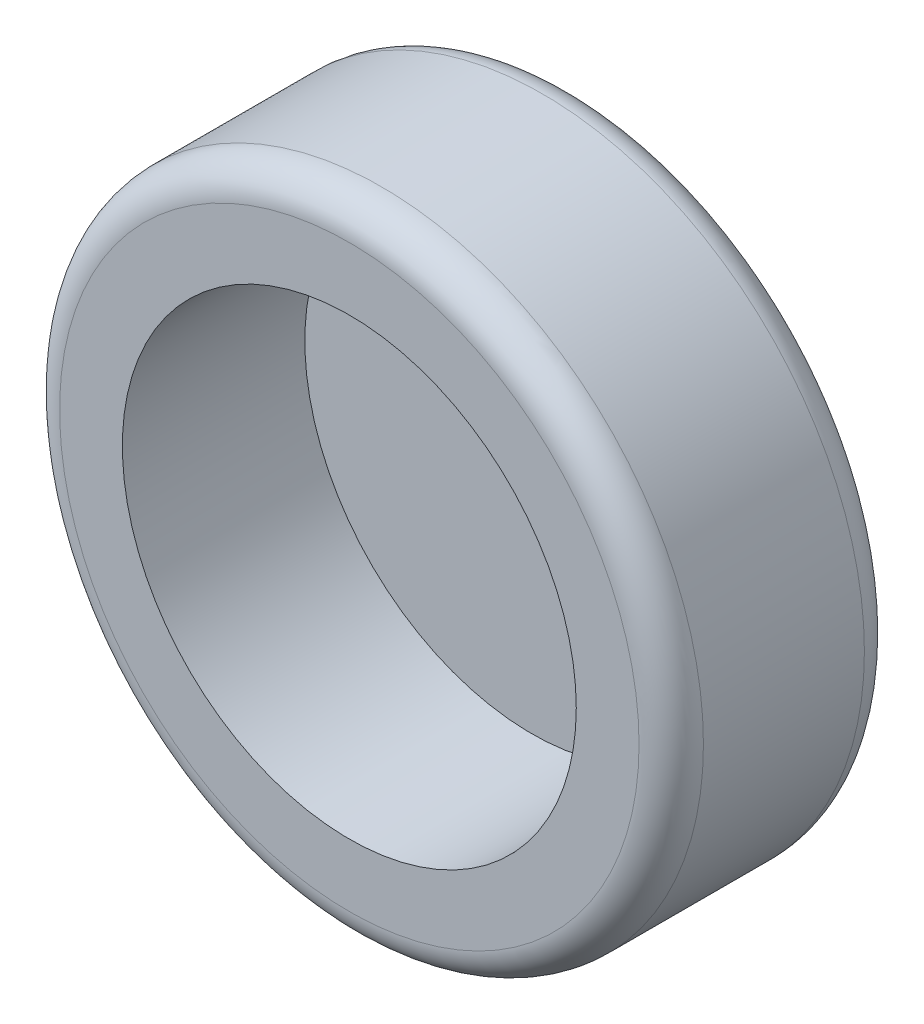
ISO-10303-21;
HEADER;
FILE_DESCRIPTION(('STEP AP214'),'2;1');
FILE_NAME('part.step','',(''),(''),'','','');
FILE_SCHEMA(('AUTOMOTIVE_DESIGN { 1 0 10303 214 1 1 1 1 }'));
ENDSEC;
DATA;
#1=APPLICATION_CONTEXT('core data for automotive mechanical design processes');
#2=APPLICATION_PROTOCOL_DEFINITION('international standard','automotive_design',2000,#1);
#3=PRODUCT_CONTEXT('',#1,'mechanical');
#4=PRODUCT('Part','Part','',(#3));
#5=PRODUCT_RELATED_PRODUCT_CATEGORY('part','',(#4));
#6=PRODUCT_DEFINITION_FORMATION('','',#4);
#7=PRODUCT_DEFINITION_CONTEXT('part definition',#1,'design');
#8=PRODUCT_DEFINITION('design','',#6,#7);
#9=PRODUCT_DEFINITION_SHAPE('','',#8);
#10=(LENGTH_UNIT() NAMED_UNIT(*) SI_UNIT(.MILLI.,.METRE.));
#11=(NAMED_UNIT(*) PLANE_ANGLE_UNIT() SI_UNIT($,.RADIAN.));
#12=(NAMED_UNIT(*) SI_UNIT($,.STERADIAN.) SOLID_ANGLE_UNIT());
#13=UNCERTAINTY_MEASURE_WITH_UNIT(LENGTH_MEASURE(1.E-05),#10,'distance_accuracy_value','');
#14=(GEOMETRIC_REPRESENTATION_CONTEXT(3) GLOBAL_UNCERTAINTY_ASSIGNED_CONTEXT((#13)) GLOBAL_UNIT_ASSIGNED_CONTEXT((#10,
#11,#12)) REPRESENTATION_CONTEXT('',''));
#15=CARTESIAN_POINT('',(0.,0.,0.));
#16=DIRECTION('',(0.,0.,1.));
#17=DIRECTION('',(1.,0.,0.));
#18=AXIS2_PLACEMENT_3D('',#15,#16,#17);
#19=CARTESIAN_POINT('',(0.,0.,21.));
#20=DIRECTION('',(0.,0.,1.));
#21=DIRECTION('',(1.,0.,0.));
#22=AXIS2_PLACEMENT_3D('',#19,#20,#21);
#23=PLANE('',#22);
#24=CARTESIAN_POINT('',(0.,0.,21.));
#25=DIRECTION('',(0.,0.,1.));
#26=DIRECTION('',(1.,0.,0.));
#27=AXIS2_PLACEMENT_3D('',#24,#25,#26);
#28=CIRCLE('',#27,27.);
#29=CARTESIAN_POINT('',(27.,0.,21.));
#30=VERTEX_POINT('',#29);
#31=EDGE_CURVE('E64',#30,#30,#28,.T.);
#32=ORIENTED_EDGE('',*,*,#31,.T.);
#33=EDGE_LOOP('',(#32));
#34=FACE_BOUND('',#33,.T.);
#35=CARTESIAN_POINT('',(0.,0.,21.));
#36=DIRECTION('',(0.,0.,1.));
#37=DIRECTION('',(1.,0.,0.));
#38=AXIS2_PLACEMENT_3D('',#35,#36,#37);
#39=CIRCLE('',#38,21.15);
#40=CARTESIAN_POINT('',(21.15,0.,21.));
#41=VERTEX_POINT('',#40);
#42=EDGE_CURVE('E47',#41,#41,#39,.T.);
#43=ORIENTED_EDGE('',*,*,#42,.F.);
#44=EDGE_LOOP('',(#43));
#45=FACE_BOUND('',#44,.T.);
#46=ADVANCED_FACE('F39',(#34,#45),#23,.T.);
#47=CARTESIAN_POINT('',(0.,0.,-59.8212336883819));
#48=DIRECTION('',(0.,0.,1.));
#49=DIRECTION('',(1.,0.,0.));
#50=AXIS2_PLACEMENT_3D('',#47,#48,#49);
#51=CYLINDRICAL_SURFACE('',#50,21.15);
#52=CARTESIAN_POINT('',(0.,0.,4.));
#53=DIRECTION('',(0.,0.,1.));
#54=DIRECTION('',(1.,0.,0.));
#55=AXIS2_PLACEMENT_3D('',#52,#53,#54);
#56=CIRCLE('',#55,21.15);
#57=CARTESIAN_POINT('',(21.15,0.,4.));
#58=VERTEX_POINT('',#57);
#59=EDGE_CURVE('E11',#58,#58,#56,.F.);
#60=ORIENTED_EDGE('',*,*,#59,.T.);
#61=EDGE_LOOP('',(#60));
#62=FACE_BOUND('',#61,.T.);
#63=ORIENTED_EDGE('',*,*,#42,.T.);
#64=EDGE_LOOP('',(#63));
#65=FACE_BOUND('',#64,.T.);
#66=ADVANCED_FACE('F85',(#62,#65),#51,.F.);
#67=CARTESIAN_POINT('',(0.,0.,4.));
#68=DIRECTION('',(0.,0.,1.));
#69=DIRECTION('',(1.,0.,0.));
#70=AXIS2_PLACEMENT_3D('',#67,#68,#69);
#71=PLANE('',#70);
#72=ORIENTED_EDGE('',*,*,#59,.F.);
#73=EDGE_LOOP('',(#72));
#74=FACE_BOUND('',#73,.T.);
#75=ADVANCED_FACE('F90',(#74),#71,.T.);
#76=CARTESIAN_POINT('',(0.,0.,18.));
#77=DIRECTION('',(0.,0.,1.));
#78=DIRECTION('',(1.,0.,0.));
#79=AXIS2_PLACEMENT_3D('',#76,#77,#78);
#80=TOROIDAL_SURFACE('',#79,27.,3.);
#81=ORIENTED_EDGE('',*,*,#31,.F.);
#82=EDGE_LOOP('',(#81));
#83=FACE_BOUND('',#82,.T.);
#84=CARTESIAN_POINT('',(0.,0.,18.));
#85=DIRECTION('',(0.,0.,1.));
#86=DIRECTION('',(1.,0.,0.));
#87=AXIS2_PLACEMENT_3D('',#84,#85,#86);
#88=CIRCLE('',#87,30.);
#89=CARTESIAN_POINT('',(-30.,0.,18.));
#90=VERTEX_POINT('',#89);
#91=EDGE_CURVE('E60',#90,#90,#88,.T.);
#92=ORIENTED_EDGE('',*,*,#91,.T.);
#93=EDGE_LOOP('',(#92));
#94=FACE_BOUND('',#93,.T.);
#95=ADVANCED_FACE('F96',(#83,#94),#80,.T.);
#96=CARTESIAN_POINT('',(0.,0.,21.));
#97=DIRECTION('',(0.,0.,-1.));
#98=DIRECTION('',(-1.,0.,0.));
#99=AXIS2_PLACEMENT_3D('',#96,#97,#98);
#100=CYLINDRICAL_SURFACE('',#99,30.);
#101=CARTESIAN_POINT('',(0.,0.,3.));
#102=DIRECTION('',(0.,0.,1.));
#103=DIRECTION('',(1.,0.,0.));
#104=AXIS2_PLACEMENT_3D('',#101,#102,#103);
#105=CIRCLE('',#104,30.);
#106=CARTESIAN_POINT('',(-30.,0.,3.));
#107=VERTEX_POINT('',#106);
#108=EDGE_CURVE('E57',#107,#107,#105,.T.);
#109=CARTESIAN_POINT('',(-30.,0.,18.));
#110=CARTESIAN_POINT('',(-30.,0.,17.84375));
#111=CARTESIAN_POINT('',(-30.,0.,17.6875));
#112=CARTESIAN_POINT('',(-30.,0.,17.375));
#113=CARTESIAN_POINT('',(-30.,0.,17.21875));
#114=CARTESIAN_POINT('',(-30.,0.,16.90625));
#115=CARTESIAN_POINT('',(-30.,0.,16.75));
#116=CARTESIAN_POINT('',(-30.,0.,16.4375));
#117=CARTESIAN_POINT('',(-30.,0.,16.28125));
#118=CARTESIAN_POINT('',(-30.,0.,15.96875));
#119=CARTESIAN_POINT('',(-30.,0.,15.8125));
#120=CARTESIAN_POINT('',(-30.,0.,15.5));
#121=CARTESIAN_POINT('',(-30.,0.,15.34375));
#122=CARTESIAN_POINT('',(-30.,0.,15.03125));
#123=CARTESIAN_POINT('',(-30.,0.,14.875));
#124=CARTESIAN_POINT('',(-30.,0.,14.5625));
#125=CARTESIAN_POINT('',(-30.,0.,14.40625));
#126=CARTESIAN_POINT('',(-30.,0.,14.09375));
#127=CARTESIAN_POINT('',(-30.,0.,13.9375));
#128=CARTESIAN_POINT('',(-30.,0.,13.625));
#129=CARTESIAN_POINT('',(-30.,0.,13.46875));
#130=CARTESIAN_POINT('',(-30.,0.,13.15625));
#131=CARTESIAN_POINT('',(-30.,0.,13.));
#132=CARTESIAN_POINT('',(-30.,0.,12.6875));
#133=CARTESIAN_POINT('',(-30.,0.,12.53125));
#134=CARTESIAN_POINT('',(-30.,0.,12.21875));
#135=CARTESIAN_POINT('',(-30.,0.,12.0625));
#136=CARTESIAN_POINT('',(-30.,0.,11.75));
#137=CARTESIAN_POINT('',(-30.,0.,11.59375));
#138=CARTESIAN_POINT('',(-30.,0.,11.28125));
#139=CARTESIAN_POINT('',(-30.,0.,11.125));
#140=CARTESIAN_POINT('',(-30.,0.,10.8125));
#141=CARTESIAN_POINT('',(-30.,0.,10.65625));
#142=CARTESIAN_POINT('',(-30.,0.,10.34375));
#143=CARTESIAN_POINT('',(-30.,0.,10.1875));
#144=CARTESIAN_POINT('',(-30.,0.,9.875));
#145=CARTESIAN_POINT('',(-30.,0.,9.71875));
#146=CARTESIAN_POINT('',(-30.,0.,9.40625));
#147=CARTESIAN_POINT('',(-30.,0.,9.25));
#148=CARTESIAN_POINT('',(-30.,0.,8.9375));
#149=CARTESIAN_POINT('',(-30.,0.,8.78125));
#150=CARTESIAN_POINT('',(-30.,0.,8.46875));
#151=CARTESIAN_POINT('',(-30.,0.,8.3125));
#152=CARTESIAN_POINT('',(-30.,0.,8.));
#153=CARTESIAN_POINT('',(-30.,0.,7.84375));
#154=CARTESIAN_POINT('',(-30.,0.,7.53125));
#155=CARTESIAN_POINT('',(-30.,0.,7.375));
#156=CARTESIAN_POINT('',(-30.,0.,7.0625));
#157=CARTESIAN_POINT('',(-30.,0.,6.90625));
#158=CARTESIAN_POINT('',(-30.,0.,6.59375));
#159=CARTESIAN_POINT('',(-30.,0.,6.4375));
#160=CARTESIAN_POINT('',(-30.,0.,6.125));
#161=CARTESIAN_POINT('',(-30.,0.,5.96875));
#162=CARTESIAN_POINT('',(-30.,0.,5.65625));
#163=CARTESIAN_POINT('',(-30.,0.,5.5));
#164=CARTESIAN_POINT('',(-30.,0.,5.1875));
#165=CARTESIAN_POINT('',(-30.,0.,5.03125));
#166=CARTESIAN_POINT('',(-30.,0.,4.71875));
#167=CARTESIAN_POINT('',(-30.,0.,4.5625));
#168=CARTESIAN_POINT('',(-30.,0.,4.25));
#169=CARTESIAN_POINT('',(-30.,0.,4.09375));
#170=CARTESIAN_POINT('',(-30.,0.,3.78125));
#171=CARTESIAN_POINT('',(-30.,0.,3.625));
#172=CARTESIAN_POINT('',(-30.,0.,3.3125));
#173=CARTESIAN_POINT('',(-30.,0.,3.15625));
#174=CARTESIAN_POINT('',(-30.,0.,3.));
#175=B_SPLINE_CURVE_WITH_KNOTS('',3,(#109,#110,#111,#112,#113,#114,#115,#116,#117,#118,#119,
#120,#121,#122,#123,#124,#125,#126,#127,#128,#129,#130,#131,#132,#133,#134,#135,#136,#137,#138,
#139,#140,#141,#142,#143,#144,#145,#146,#147,#148,#149,#150,#151,#152,#153,#154,#155,#156,#157,
#158,#159,#160,#161,#162,#163,#164,#165,#166,#167,#168,#169,#170,#171,#172,#173,#174),
.UNSPECIFIED.,.F.,.F.,(4,2,2,2,2,2,2,2,2,2,2,2,2,2,2,2,2,2,2,2,2,2,2,2,2,2,2,2,2,2,2,2,4),(0.,
0.46875,0.937499999999997,1.40625,1.875,2.34375,2.8125,3.28125,3.75,4.21875,4.6875,5.15625,
5.625,6.09375,6.5625,7.03125,7.5,7.96875,8.4375,8.90625,9.375,9.84375,10.3125,10.78125,11.25,
11.71875,12.1875,12.65625,13.125,13.59375,14.0625,14.53125,15.),.UNSPECIFIED.);
#176=EDGE_CURVE('BSEAM41',#90,#107,#175,.T.);
#177=ORIENTED_EDGE('',*,*,#91,.F.);
#178=ORIENTED_EDGE('',*,*,#108,.T.);
#179=ORIENTED_EDGE('',*,*,#176,.T.);
#180=ORIENTED_EDGE('',*,*,#176,.F.);
#181=EDGE_LOOP('',(#177,#179,#178,#180));
#182=FACE_BOUND('',#181,.T.);
#183=ADVANCED_FACE('F41',(#182),#100,.T.);
#184=CARTESIAN_POINT('',(0.,0.,3.));
#185=DIRECTION('',(0.,0.,1.));
#186=DIRECTION('',(1.,0.,0.));
#187=AXIS2_PLACEMENT_3D('',#184,#185,#186);
#188=TOROIDAL_SURFACE('',#187,27.,3.);
#189=ORIENTED_EDGE('',*,*,#108,.F.);
#190=EDGE_LOOP('',(#189));
#191=FACE_BOUND('',#190,.T.);
#192=CARTESIAN_POINT('',(0.,0.,1.36609473733174E-13));
#193=DIRECTION('',(0.,0.,1.));
#194=DIRECTION('',(1.,0.,0.));
#195=AXIS2_PLACEMENT_3D('',#192,#193,#194);
#196=CIRCLE('',#195,27.);
#197=CARTESIAN_POINT('',(27.,0.,1.36609473733174E-13));
#198=VERTEX_POINT('',#197);
#199=EDGE_CURVE('E52',#198,#198,#196,.T.);
#200=ORIENTED_EDGE('',*,*,#199,.T.);
#201=EDGE_LOOP('',(#200));
#202=FACE_BOUND('',#201,.T.);
#203=ADVANCED_FACE('F73',(#191,#202),#188,.T.);
#204=CARTESIAN_POINT('',(0.,0.,0.));
#205=DIRECTION('',(0.,0.,1.));
#206=DIRECTION('',(1.,0.,0.));
#207=AXIS2_PLACEMENT_3D('',#204,#205,#206);
#208=PLANE('',#207);
#209=ORIENTED_EDGE('',*,*,#199,.F.);
#210=EDGE_LOOP('',(#209));
#211=FACE_BOUND('',#210,.T.);
#212=ADVANCED_FACE('F76',(#211),#208,.F.);
#213=CLOSED_SHELL('',(#46,#66,#75,#95,#183,#203,#212));
#214=MANIFOLD_SOLID_BREP('B2',#213);
#215=ADVANCED_BREP_SHAPE_REPRESENTATION('',(#18,#214),#14);
#216=SHAPE_DEFINITION_REPRESENTATION(#9,#215);
ENDSEC;
END-ISO-10303-21;
